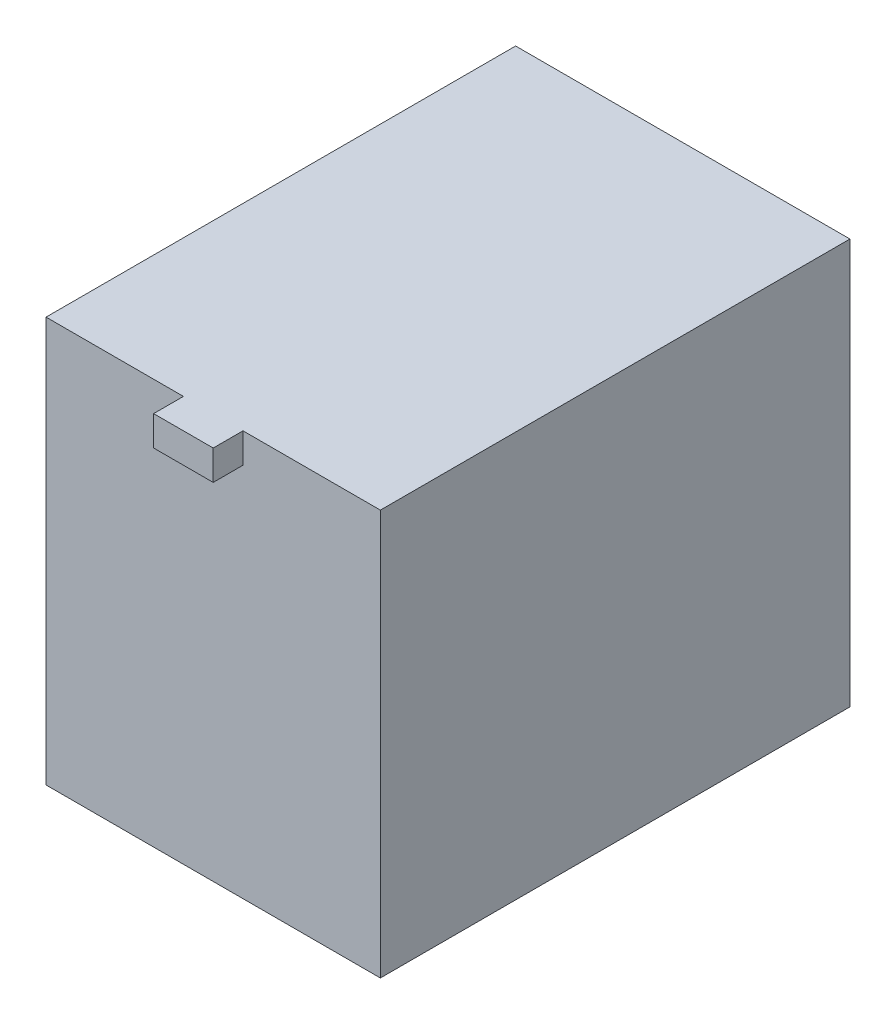
ISO-10303-21;
HEADER;
FILE_DESCRIPTION(('STEP AP214'),'2;1');
FILE_NAME('part.step','',(''),(''),'','','');
FILE_SCHEMA(('AUTOMOTIVE_DESIGN { 1 0 10303 214 1 1 1 1 }'));
ENDSEC;
DATA;
#1=APPLICATION_CONTEXT('core data for automotive mechanical design processes');
#2=APPLICATION_PROTOCOL_DEFINITION('international standard','automotive_design',2000,#1);
#3=PRODUCT_CONTEXT('',#1,'mechanical');
#4=PRODUCT('Part','Part','',(#3));
#5=PRODUCT_RELATED_PRODUCT_CATEGORY('part','',(#4));
#6=PRODUCT_DEFINITION_FORMATION('','',#4);
#7=PRODUCT_DEFINITION_CONTEXT('part definition',#1,'design');
#8=PRODUCT_DEFINITION('design','',#6,#7);
#9=PRODUCT_DEFINITION_SHAPE('','',#8);
#10=(LENGTH_UNIT() NAMED_UNIT(*) SI_UNIT(.MILLI.,.METRE.));
#11=(NAMED_UNIT(*) PLANE_ANGLE_UNIT() SI_UNIT($,.RADIAN.));
#12=(NAMED_UNIT(*) SI_UNIT($,.STERADIAN.) SOLID_ANGLE_UNIT());
#13=UNCERTAINTY_MEASURE_WITH_UNIT(LENGTH_MEASURE(1.E-05),#10,'distance_accuracy_value','');
#14=(GEOMETRIC_REPRESENTATION_CONTEXT(3) GLOBAL_UNCERTAINTY_ASSIGNED_CONTEXT((#13)) GLOBAL_UNIT_ASSIGNED_CONTEXT((#10,
#11,#12)) REPRESENTATION_CONTEXT('',''));
#15=CARTESIAN_POINT('',(0.,0.,0.));
#16=DIRECTION('',(0.,0.,1.));
#17=DIRECTION('',(1.,0.,0.));
#18=AXIS2_PLACEMENT_3D('',#15,#16,#17);
#19=CARTESIAN_POINT('',(28.05,68.,39.4));
#20=DIRECTION('',(-1.,0.,0.));
#21=DIRECTION('',(0.,0.,1.));
#22=AXIS2_PLACEMENT_3D('',#19,#20,#21);
#23=PLANE('',#22);
#24=DIRECTION('',(0.,0.,-1.));
#25=VECTOR('',#24,1.);
#26=CARTESIAN_POINT('',(28.05,0.,39.4));
#27=LINE('',#26,#25);
#28=CARTESIAN_POINT('',(28.05,0.,39.4));
#29=VERTEX_POINT('',#28);
#30=CARTESIAN_POINT('',(28.05,0.,-39.4));
#31=VERTEX_POINT('',#30);
#32=EDGE_CURVE('E128',#29,#31,#27,.T.);
#33=ORIENTED_EDGE('',*,*,#32,.T.);
#34=DIRECTION('',(0.,-1.,0.));
#35=VECTOR('',#34,1.);
#36=CARTESIAN_POINT('',(28.05,68.,-39.4));
#37=LINE('',#36,#35);
#38=CARTESIAN_POINT('',(28.05,68.,-39.4));
#39=VERTEX_POINT('',#38);
#40=EDGE_CURVE('E11',#39,#31,#37,.T.);
#41=ORIENTED_EDGE('',*,*,#40,.F.);
#42=DIRECTION('',(0.,0.,-1.));
#43=VECTOR('',#42,1.);
#44=CARTESIAN_POINT('',(28.05,68.,39.4));
#45=LINE('',#44,#43);
#46=CARTESIAN_POINT('',(28.05,68.,39.4));
#47=VERTEX_POINT('',#46);
#48=EDGE_CURVE('E137',#47,#39,#45,.T.);
#49=ORIENTED_EDGE('',*,*,#48,.F.);
#50=DIRECTION('',(0.,-1.,0.));
#51=VECTOR('',#50,1.);
#52=CARTESIAN_POINT('',(28.05,68.,39.4));
#53=LINE('',#52,#51);
#54=EDGE_CURVE('E144',#47,#29,#53,.T.);
#55=ORIENTED_EDGE('',*,*,#54,.T.);
#56=EDGE_LOOP('',(#33,#41,#49,#55));
#57=FACE_BOUND('',#56,.T.);
#58=ADVANCED_FACE('F39',(#57),#23,.F.);
#59=CARTESIAN_POINT('',(-28.05,68.,-39.4));
#60=DIRECTION('',(0.,0.,1.));
#61=DIRECTION('',(1.,0.,0.));
#62=AXIS2_PLACEMENT_3D('',#59,#60,#61);
#63=PLANE('',#62);
#64=DIRECTION('',(-1.,0.,0.));
#65=VECTOR('',#64,1.);
#66=CARTESIAN_POINT('',(-28.05,0.,-39.4));
#67=LINE('',#66,#65);
#68=CARTESIAN_POINT('',(-28.05,0.,-39.4));
#69=VERTEX_POINT('',#68);
#70=EDGE_CURVE('E131',#31,#69,#67,.T.);
#71=ORIENTED_EDGE('',*,*,#70,.T.);
#72=DIRECTION('',(0.,-1.,0.));
#73=VECTOR('',#72,1.);
#74=CARTESIAN_POINT('',(-28.05,68.,-39.4));
#75=LINE('',#74,#73);
#76=CARTESIAN_POINT('',(-28.05,68.,-39.4));
#77=VERTEX_POINT('',#76);
#78=EDGE_CURVE('E46',#77,#69,#75,.T.);
#79=ORIENTED_EDGE('',*,*,#78,.F.);
#80=DIRECTION('',(-1.,0.,0.));
#81=VECTOR('',#80,1.);
#82=CARTESIAN_POINT('',(-28.05,68.,-39.4));
#83=LINE('',#82,#81);
#84=EDGE_CURVE('E139',#39,#77,#83,.T.);
#85=ORIENTED_EDGE('',*,*,#84,.F.);
#86=ORIENTED_EDGE('',*,*,#40,.T.);
#87=EDGE_LOOP('',(#71,#79,#85,#86));
#88=FACE_BOUND('',#87,.T.);
#89=ADVANCED_FACE('F193',(#88),#63,.F.);
#90=CARTESIAN_POINT('',(-28.05,68.,39.4));
#91=DIRECTION('',(1.,0.,0.));
#92=DIRECTION('',(0.,0.,-1.));
#93=AXIS2_PLACEMENT_3D('',#90,#91,#92);
#94=PLANE('',#93);
#95=DIRECTION('',(0.,0.,1.));
#96=VECTOR('',#95,1.);
#97=CARTESIAN_POINT('',(-28.05,0.,39.4));
#98=LINE('',#97,#96);
#99=CARTESIAN_POINT('',(-28.05,0.,39.4));
#100=VERTEX_POINT('',#99);
#101=EDGE_CURVE('E147',#69,#100,#98,.T.);
#102=ORIENTED_EDGE('',*,*,#101,.T.);
#103=DIRECTION('',(0.,-1.,0.));
#104=VECTOR('',#103,1.);
#105=CARTESIAN_POINT('',(-28.05,68.,39.4));
#106=LINE('',#105,#104);
#107=CARTESIAN_POINT('',(-28.05,68.,39.4));
#108=VERTEX_POINT('',#107);
#109=EDGE_CURVE('E152',#108,#100,#106,.T.);
#110=ORIENTED_EDGE('',*,*,#109,.F.);
#111=DIRECTION('',(0.,0.,1.));
#112=VECTOR('',#111,1.);
#113=CARTESIAN_POINT('',(-28.05,68.,39.4));
#114=LINE('',#113,#112);
#115=EDGE_CURVE('E142',#77,#108,#114,.T.);
#116=ORIENTED_EDGE('',*,*,#115,.F.);
#117=ORIENTED_EDGE('',*,*,#78,.T.);
#118=EDGE_LOOP('',(#102,#110,#116,#117));
#119=FACE_BOUND('',#118,.T.);
#120=ADVANCED_FACE('F159',(#119),#94,.F.);
#121=CARTESIAN_POINT('',(-28.05,68.,39.4));
#122=DIRECTION('',(0.,0.,-1.));
#123=DIRECTION('',(-1.,0.,0.));
#124=AXIS2_PLACEMENT_3D('',#121,#122,#123);
#125=PLANE('',#124);
#126=DIRECTION('',(1.,0.,0.));
#127=VECTOR('',#126,1.);
#128=CARTESIAN_POINT('',(-28.05,68.,39.4));
#129=LINE('',#128,#127);
#130=CARTESIAN_POINT('',(5.,68.,39.4));
#131=VERTEX_POINT('',#130);
#132=EDGE_CURVE('E58',#131,#47,#129,.T.);
#133=ORIENTED_EDGE('',*,*,#132,.F.);
#134=DIRECTION('',(0.,-1.,0.));
#135=VECTOR('',#134,1.);
#136=CARTESIAN_POINT('',(5.00000000000001,0.,39.4));
#137=LINE('',#136,#135);
#138=CARTESIAN_POINT('',(5.,63.,39.4));
#139=VERTEX_POINT('',#138);
#140=EDGE_CURVE('E53',#131,#139,#137,.T.);
#141=ORIENTED_EDGE('',*,*,#140,.T.);
#142=DIRECTION('',(-1.,0.,0.));
#143=VECTOR('',#142,1.);
#144=CARTESIAN_POINT('',(0.,63.,39.4));
#145=LINE('',#144,#143);
#146=CARTESIAN_POINT('',(-4.99999999999998,63.,39.4));
#147=VERTEX_POINT('',#146);
#148=EDGE_CURVE('E175',#139,#147,#145,.T.);
#149=ORIENTED_EDGE('',*,*,#148,.T.);
#150=DIRECTION('',(0.,-1.,0.));
#151=VECTOR('',#150,1.);
#152=CARTESIAN_POINT('',(-5.00000000000003,0.,39.4));
#153=LINE('',#152,#151);
#154=CARTESIAN_POINT('',(-4.99999999999997,68.,39.4));
#155=VERTEX_POINT('',#154);
#156=EDGE_CURVE('E177',#155,#147,#153,.T.);
#157=ORIENTED_EDGE('',*,*,#156,.F.);
#158=EDGE_CURVE('E127',#108,#155,#129,.T.);
#159=ORIENTED_EDGE('',*,*,#158,.F.);
#160=ORIENTED_EDGE('',*,*,#109,.T.);
#161=DIRECTION('',(1.,0.,0.));
#162=VECTOR('',#161,1.);
#163=CARTESIAN_POINT('',(-28.05,0.,39.4));
#164=LINE('',#163,#162);
#165=EDGE_CURVE('E140',#100,#29,#164,.T.);
#166=ORIENTED_EDGE('',*,*,#165,.T.);
#167=ORIENTED_EDGE('',*,*,#54,.F.);
#168=EDGE_LOOP('',(#133,#141,#149,#157,#159,#160,#166,#167));
#169=FACE_BOUND('',#168,.T.);
#170=ADVANCED_FACE('F166',(#169),#125,.F.);
#171=CARTESIAN_POINT('',(0.,68.,0.));
#172=DIRECTION('',(0.,-1.,0.));
#173=DIRECTION('',(0.,0.,-1.));
#174=AXIS2_PLACEMENT_3D('',#171,#172,#173);
#175=PLANE('',#174);
#176=ORIENTED_EDGE('',*,*,#48,.T.);
#177=ORIENTED_EDGE('',*,*,#84,.T.);
#178=ORIENTED_EDGE('',*,*,#115,.T.);
#179=ORIENTED_EDGE('',*,*,#158,.T.);
#180=DIRECTION('',(0.,0.,-1.));
#181=VECTOR('',#180,1.);
#182=CARTESIAN_POINT('',(-4.99999999999997,68.,44.4));
#183=LINE('',#182,#181);
#184=CARTESIAN_POINT('',(-4.99999999999997,68.,44.4));
#185=VERTEX_POINT('',#184);
#186=EDGE_CURVE('E107',#185,#155,#183,.T.);
#187=ORIENTED_EDGE('',*,*,#186,.F.);
#188=DIRECTION('',(-1.,0.,0.));
#189=VECTOR('',#188,1.);
#190=CARTESIAN_POINT('',(0.,68.,44.4));
#191=LINE('',#190,#189);
#192=CARTESIAN_POINT('',(5.,68.,44.4));
#193=VERTEX_POINT('',#192);
#194=EDGE_CURVE('E114',#193,#185,#191,.T.);
#195=ORIENTED_EDGE('',*,*,#194,.F.);
#196=DIRECTION('',(0.,0.,-1.));
#197=VECTOR('',#196,1.);
#198=CARTESIAN_POINT('',(5.,68.,44.4));
#199=LINE('',#198,#197);
#200=EDGE_CURVE('E170',#193,#131,#199,.T.);
#201=ORIENTED_EDGE('',*,*,#200,.T.);
#202=ORIENTED_EDGE('',*,*,#132,.T.);
#203=EDGE_LOOP('',(#176,#177,#178,#179,#187,#195,#201,#202));
#204=FACE_BOUND('',#203,.T.);
#205=ADVANCED_FACE('F125',(#204),#175,.F.);
#206=CARTESIAN_POINT('',(0.,0.,0.));
#207=DIRECTION('',(0.,-1.,0.));
#208=DIRECTION('',(0.,0.,-1.));
#209=AXIS2_PLACEMENT_3D('',#206,#207,#208);
#210=PLANE('',#209);
#211=ORIENTED_EDGE('',*,*,#32,.F.);
#212=ORIENTED_EDGE('',*,*,#165,.F.);
#213=ORIENTED_EDGE('',*,*,#101,.F.);
#214=ORIENTED_EDGE('',*,*,#70,.F.);
#215=EDGE_LOOP('',(#211,#212,#213,#214));
#216=FACE_BOUND('',#215,.T.);
#217=ADVANCED_FACE('F165',(#216),#210,.T.);
#218=CARTESIAN_POINT('',(-5.00000000000003,0.,44.4));
#219=DIRECTION('',(1.,0.,0.));
#220=DIRECTION('',(0.,1.,0.));
#221=AXIS2_PLACEMENT_3D('',#218,#219,#220);
#222=PLANE('',#221);
#223=ORIENTED_EDGE('',*,*,#156,.T.);
#224=DIRECTION('',(0.,0.,-1.));
#225=VECTOR('',#224,1.);
#226=CARTESIAN_POINT('',(-4.99999999999998,63.,44.4));
#227=LINE('',#226,#225);
#228=CARTESIAN_POINT('',(-4.99999999999998,63.,44.4));
#229=VERTEX_POINT('',#228);
#230=EDGE_CURVE('E109',#229,#147,#227,.T.);
#231=ORIENTED_EDGE('',*,*,#230,.F.);
#232=DIRECTION('',(0.,-1.,0.));
#233=VECTOR('',#232,1.);
#234=CARTESIAN_POINT('',(-5.00000000000003,0.,44.4));
#235=LINE('',#234,#233);
#236=EDGE_CURVE('E102',#185,#229,#235,.T.);
#237=ORIENTED_EDGE('',*,*,#236,.F.);
#238=ORIENTED_EDGE('',*,*,#186,.T.);
#239=EDGE_LOOP('',(#223,#231,#237,#238));
#240=FACE_BOUND('',#239,.T.);
#241=ADVANCED_FACE('F105',(#240),#222,.F.);
#242=CARTESIAN_POINT('',(0.,63.,44.4));
#243=DIRECTION('',(0.,-1.,0.));
#244=DIRECTION('',(0.,0.,-1.));
#245=AXIS2_PLACEMENT_3D('',#242,#243,#244);
#246=PLANE('',#245);
#247=ORIENTED_EDGE('',*,*,#148,.F.);
#248=DIRECTION('',(0.,0.,-1.));
#249=VECTOR('',#248,1.);
#250=CARTESIAN_POINT('',(5.,63.,44.4));
#251=LINE('',#250,#249);
#252=CARTESIAN_POINT('',(5.,63.,44.4));
#253=VERTEX_POINT('',#252);
#254=EDGE_CURVE('E133',#253,#139,#251,.T.);
#255=ORIENTED_EDGE('',*,*,#254,.F.);
#256=DIRECTION('',(-1.,0.,0.));
#257=VECTOR('',#256,1.);
#258=CARTESIAN_POINT('',(0.,63.,44.4));
#259=LINE('',#258,#257);
#260=EDGE_CURVE('E113',#253,#229,#259,.T.);
#261=ORIENTED_EDGE('',*,*,#260,.T.);
#262=ORIENTED_EDGE('',*,*,#230,.T.);
#263=EDGE_LOOP('',(#247,#255,#261,#262));
#264=FACE_BOUND('',#263,.T.);
#265=ADVANCED_FACE('F183',(#264),#246,.T.);
#266=CARTESIAN_POINT('',(5.00000000000001,0.,44.4));
#267=DIRECTION('',(1.,0.,0.));
#268=DIRECTION('',(0.,1.,0.));
#269=AXIS2_PLACEMENT_3D('',#266,#267,#268);
#270=PLANE('',#269);
#271=ORIENTED_EDGE('',*,*,#140,.F.);
#272=ORIENTED_EDGE('',*,*,#200,.F.);
#273=DIRECTION('',(0.,-1.,0.));
#274=VECTOR('',#273,1.);
#275=CARTESIAN_POINT('',(5.00000000000001,0.,44.4));
#276=LINE('',#275,#274);
#277=EDGE_CURVE('E120',#193,#253,#276,.T.);
#278=ORIENTED_EDGE('',*,*,#277,.T.);
#279=ORIENTED_EDGE('',*,*,#254,.T.);
#280=EDGE_LOOP('',(#271,#272,#278,#279));
#281=FACE_BOUND('',#280,.T.);
#282=ADVANCED_FACE('F173',(#281),#270,.T.);
#283=CARTESIAN_POINT('',(0.,0.,44.4));
#284=DIRECTION('',(0.,0.,1.));
#285=DIRECTION('',(1.,0.,0.));
#286=AXIS2_PLACEMENT_3D('',#283,#284,#285);
#287=PLANE('',#286);
#288=ORIENTED_EDGE('',*,*,#194,.T.);
#289=ORIENTED_EDGE('',*,*,#236,.T.);
#290=ORIENTED_EDGE('',*,*,#260,.F.);
#291=ORIENTED_EDGE('',*,*,#277,.F.);
#292=EDGE_LOOP('',(#288,#289,#290,#291));
#293=FACE_BOUND('',#292,.T.);
#294=ADVANCED_FACE('F118',(#293),#287,.T.);
#295=CLOSED_SHELL('',(#58,#89,#120,#170,#205,#217,#241,#265,#282,#294));
#296=MANIFOLD_SOLID_BREP('B2',#295);
#297=ADVANCED_BREP_SHAPE_REPRESENTATION('',(#18,#296),#14);
#298=SHAPE_DEFINITION_REPRESENTATION(#9,#297);
ENDSEC;
END-ISO-10303-21;
